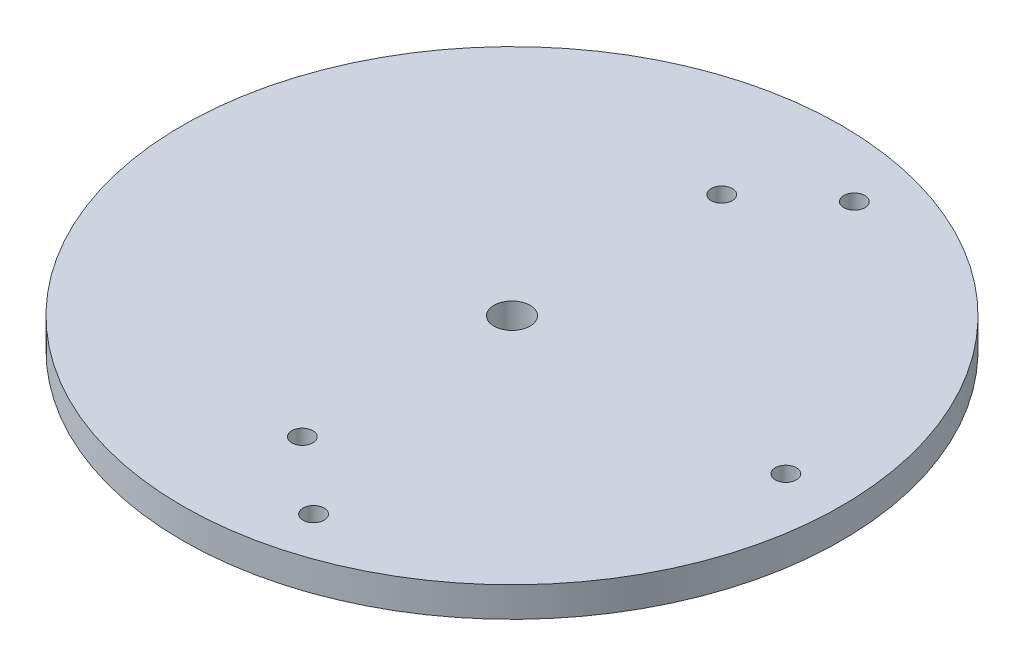
ISO-10303-21;
HEADER;
FILE_DESCRIPTION(('STEP AP214'),'2;1');
FILE_NAME('part.step','',(''),(''),'','','');
FILE_SCHEMA(('AUTOMOTIVE_DESIGN { 1 0 10303 214 1 1 1 1 }'));
ENDSEC;
DATA;
#1=APPLICATION_CONTEXT('core data for automotive mechanical design processes');
#2=APPLICATION_PROTOCOL_DEFINITION('international standard','automotive_design',2000,#1);
#3=PRODUCT_CONTEXT('',#1,'mechanical');
#4=PRODUCT('Part','Part','',(#3));
#5=PRODUCT_RELATED_PRODUCT_CATEGORY('part','',(#4));
#6=PRODUCT_DEFINITION_FORMATION('','',#4);
#7=PRODUCT_DEFINITION_CONTEXT('part definition',#1,'design');
#8=PRODUCT_DEFINITION('design','',#6,#7);
#9=PRODUCT_DEFINITION_SHAPE('','',#8);
#10=(LENGTH_UNIT() NAMED_UNIT(*) SI_UNIT(.MILLI.,.METRE.));
#11=(NAMED_UNIT(*) PLANE_ANGLE_UNIT() SI_UNIT($,.RADIAN.));
#12=(NAMED_UNIT(*) SI_UNIT($,.STERADIAN.) SOLID_ANGLE_UNIT());
#13=UNCERTAINTY_MEASURE_WITH_UNIT(LENGTH_MEASURE(1.E-05),#10,'distance_accuracy_value','');
#14=(GEOMETRIC_REPRESENTATION_CONTEXT(3) GLOBAL_UNCERTAINTY_ASSIGNED_CONTEXT((#13)) GLOBAL_UNIT_ASSIGNED_CONTEXT((#10,
#11,#12)) REPRESENTATION_CONTEXT('',''));
#15=CARTESIAN_POINT('',(0.,0.,0.));
#16=DIRECTION('',(0.,0.,1.));
#17=DIRECTION('',(1.,0.,0.));
#18=AXIS2_PLACEMENT_3D('',#15,#16,#17);
#19=CARTESIAN_POINT('',(-16.0725151747669,6.35,-12.0543863810752));
#20=DIRECTION('',(0.,-1.,0.));
#21=DIRECTION('',(0.,0.,-1.));
#22=AXIS2_PLACEMENT_3D('',#19,#20,#21);
#23=CYLINDRICAL_SURFACE('',#22,69.85);
#24=CARTESIAN_POINT('',(-16.0725151747669,6.35,-12.0543863810752));
#25=DIRECTION('',(0.,1.,0.));
#26=DIRECTION('',(0.,0.,1.));
#27=AXIS2_PLACEMENT_3D('',#24,#25,#26);
#28=CIRCLE('',#27,69.85);
#29=CARTESIAN_POINT('',(-16.0725151747669,6.35,57.7956136189248));
#30=VERTEX_POINT('',#29);
#31=EDGE_CURVE('E10',#30,#30,#28,.T.);
#32=ORIENTED_EDGE('',*,*,#31,.F.);
#33=EDGE_LOOP('',(#32));
#34=FACE_BOUND('',#33,.T.);
#35=CARTESIAN_POINT('',(-16.0725151747669,0.,-12.0543863810752));
#36=DIRECTION('',(0.,1.,0.));
#37=DIRECTION('',(0.,0.,1.));
#38=AXIS2_PLACEMENT_3D('',#35,#36,#37);
#39=CIRCLE('',#38,69.85);
#40=CARTESIAN_POINT('',(-16.0725151747669,0.,57.7956136189248));
#41=VERTEX_POINT('',#40);
#42=EDGE_CURVE('E44',#41,#41,#39,.T.);
#43=ORIENTED_EDGE('',*,*,#42,.T.);
#44=EDGE_LOOP('',(#43));
#45=FACE_BOUND('',#44,.T.);
#46=ADVANCED_FACE('F37',(#34,#45),#23,.T.);
#47=CARTESIAN_POINT('',(-16.0725151747669,6.35,-12.0543863810752));
#48=DIRECTION('',(0.,1.,0.));
#49=DIRECTION('',(0.,0.,1.));
#50=AXIS2_PLACEMENT_3D('',#47,#48,#49);
#51=PLANE('',#50);
#52=CARTESIAN_POINT('',(-0.738778165919699,6.35,-69.280671967993));
#53=DIRECTION('',(0.,1.,0.));
#54=DIRECTION('',(0.,0.,1.));
#55=AXIS2_PLACEMENT_3D('',#52,#53,#54);
#56=CIRCLE('',#55,2.238375);
#57=CARTESIAN_POINT('',(-0.738778165919699,6.35,-67.042296967993));
#58=VERTEX_POINT('',#57);
#59=EDGE_CURVE('E58',#58,#58,#56,.T.);
#60=ORIENTED_EDGE('',*,*,#59,.F.);
#61=EDGE_LOOP('',(#60));
#62=FACE_BOUND('',#61,.T.);
#63=CARTESIAN_POINT('',(-16.0725151747669,6.35,-56.5043863810752));
#64=DIRECTION('',(0.,1.,0.));
#65=DIRECTION('',(0.,0.,1.));
#66=AXIS2_PLACEMENT_3D('',#63,#64,#65);
#67=CIRCLE('',#66,2.238375);
#68=CARTESIAN_POINT('',(-16.0725151747669,6.35,-54.2660113810752));
#69=VERTEX_POINT('',#68);
#70=EDGE_CURVE('E134',#69,#69,#67,.T.);
#71=ORIENTED_EDGE('',*,*,#70,.F.);
#72=EDGE_LOOP('',(#71));
#73=FACE_BOUND('',#72,.T.);
#74=CARTESIAN_POINT('',(-16.0725151747669,6.35,-12.0543863810752));
#75=DIRECTION('',(0.,1.,0.));
#76=DIRECTION('',(0.,0.,1.));
#77=AXIS2_PLACEMENT_3D('',#74,#75,#76);
#78=CIRCLE('',#77,3.825875);
#79=CARTESIAN_POINT('',(-16.0725151747669,6.35,-8.2285113810752));
#80=VERTEX_POINT('',#79);
#81=EDGE_CURVE('E121',#80,#80,#78,.T.);
#82=ORIENTED_EDGE('',*,*,#81,.F.);
#83=EDGE_LOOP('',(#82));
#84=FACE_BOUND('',#83,.T.);
#85=CARTESIAN_POINT('',(-16.0725151747669,6.35,32.3956136189248));
#86=DIRECTION('',(0.,1.,0.));
#87=DIRECTION('',(0.,0.,1.));
#88=AXIS2_PLACEMENT_3D('',#85,#86,#87);
#89=CIRCLE('',#88,2.238375);
#90=CARTESIAN_POINT('',(-16.0725151747669,6.35,34.6339886189248));
#91=VERTEX_POINT('',#90);
#92=EDGE_CURVE('E135',#91,#91,#89,.T.);
#93=ORIENTED_EDGE('',*,*,#92,.F.);
#94=EDGE_LOOP('',(#93));
#95=FACE_BOUND('',#94,.T.);
#96=CARTESIAN_POINT('',(-0.679642183056859,6.35,45.3925976984422));
#97=DIRECTION('',(0.,1.,0.));
#98=DIRECTION('',(0.,0.,1.));
#99=AXIS2_PLACEMENT_3D('',#96,#97,#98);
#100=CIRCLE('',#99,2.238375);
#101=CARTESIAN_POINT('',(-0.679642183056859,6.35,47.6309726984422));
#102=VERTEX_POINT('',#101);
#103=EDGE_CURVE('E140',#102,#102,#100,.T.);
#104=ORIENTED_EDGE('',*,*,#103,.F.);
#105=EDGE_LOOP('',(#104));
#106=FACE_BOUND('',#105,.T.);
#107=CARTESIAN_POINT('',(41.9664848252331,6.35,-12.0543863810752));
#108=DIRECTION('',(0.,1.,0.));
#109=DIRECTION('',(0.,0.,1.));
#110=AXIS2_PLACEMENT_3D('',#107,#108,#109);
#111=CIRCLE('',#110,2.238375);
#112=CARTESIAN_POINT('',(41.9664848252331,6.35,-9.8160113810752));
#113=VERTEX_POINT('',#112);
#114=EDGE_CURVE('E51',#113,#113,#111,.T.);
#115=ORIENTED_EDGE('',*,*,#114,.F.);
#116=EDGE_LOOP('',(#115));
#117=FACE_BOUND('',#116,.T.);
#118=ORIENTED_EDGE('',*,*,#31,.T.);
#119=EDGE_LOOP('',(#118));
#120=FACE_BOUND('',#119,.T.);
#121=ADVANCED_FACE('F88',(#62,#73,#84,#95,#106,#117,#120),#51,.T.);
#122=CARTESIAN_POINT('',(-16.0725151747669,0.,-12.0543863810752));
#123=DIRECTION('',(0.,1.,0.));
#124=DIRECTION('',(0.,0.,1.));
#125=AXIS2_PLACEMENT_3D('',#122,#123,#124);
#126=PLANE('',#125);
#127=CARTESIAN_POINT('',(-0.738778165919699,0.,-69.280671967993));
#128=DIRECTION('',(0.,1.,0.));
#129=DIRECTION('',(0.,0.,1.));
#130=AXIS2_PLACEMENT_3D('',#127,#128,#129);
#131=CIRCLE('',#130,2.238375);
#132=CARTESIAN_POINT('',(-0.738778165919699,0.,-67.042296967993));
#133=VERTEX_POINT('',#132);
#134=EDGE_CURVE('E40',#133,#133,#131,.T.);
#135=ORIENTED_EDGE('',*,*,#134,.T.);
#136=EDGE_LOOP('',(#135));
#137=FACE_BOUND('',#136,.T.);
#138=CARTESIAN_POINT('',(-16.0725151747669,0.,-56.5043863810752));
#139=DIRECTION('',(0.,1.,0.));
#140=DIRECTION('',(0.,0.,1.));
#141=AXIS2_PLACEMENT_3D('',#138,#139,#140);
#142=CIRCLE('',#141,2.238375);
#143=CARTESIAN_POINT('',(-16.0725151747669,0.,-54.2660113810752));
#144=VERTEX_POINT('',#143);
#145=EDGE_CURVE('E66',#144,#144,#142,.T.);
#146=ORIENTED_EDGE('',*,*,#145,.T.);
#147=EDGE_LOOP('',(#146));
#148=FACE_BOUND('',#147,.T.);
#149=CARTESIAN_POINT('',(-16.0725151747669,0.,-12.0543863810752));
#150=DIRECTION('',(0.,1.,0.));
#151=DIRECTION('',(0.,0.,1.));
#152=AXIS2_PLACEMENT_3D('',#149,#150,#151);
#153=CIRCLE('',#152,3.825875);
#154=CARTESIAN_POINT('',(-16.0725151747669,0.,-8.2285113810752));
#155=VERTEX_POINT('',#154);
#156=EDGE_CURVE('E64',#155,#155,#153,.T.);
#157=ORIENTED_EDGE('',*,*,#156,.T.);
#158=EDGE_LOOP('',(#157));
#159=FACE_BOUND('',#158,.T.);
#160=CARTESIAN_POINT('',(-16.0725151747669,0.,32.3956136189248));
#161=DIRECTION('',(0.,1.,0.));
#162=DIRECTION('',(0.,0.,1.));
#163=AXIS2_PLACEMENT_3D('',#160,#161,#162);
#164=CIRCLE('',#163,2.238375);
#165=CARTESIAN_POINT('',(-16.0725151747669,0.,34.6339886189248));
#166=VERTEX_POINT('',#165);
#167=EDGE_CURVE('E61',#166,#166,#164,.T.);
#168=ORIENTED_EDGE('',*,*,#167,.T.);
#169=EDGE_LOOP('',(#168));
#170=FACE_BOUND('',#169,.T.);
#171=CARTESIAN_POINT('',(-0.679642183056859,0.,45.3925976984422));
#172=DIRECTION('',(0.,1.,0.));
#173=DIRECTION('',(0.,0.,1.));
#174=AXIS2_PLACEMENT_3D('',#171,#172,#173);
#175=CIRCLE('',#174,2.238375);
#176=CARTESIAN_POINT('',(-0.679642183056859,0.,47.6309726984422));
#177=VERTEX_POINT('',#176);
#178=EDGE_CURVE('E57',#177,#177,#175,.T.);
#179=ORIENTED_EDGE('',*,*,#178,.T.);
#180=EDGE_LOOP('',(#179));
#181=FACE_BOUND('',#180,.T.);
#182=CARTESIAN_POINT('',(41.9664848252331,0.,-12.0543863810752));
#183=DIRECTION('',(0.,1.,0.));
#184=DIRECTION('',(0.,0.,1.));
#185=AXIS2_PLACEMENT_3D('',#182,#183,#184);
#186=CIRCLE('',#185,2.238375);
#187=CARTESIAN_POINT('',(41.9664848252331,0.,-9.8160113810752));
#188=VERTEX_POINT('',#187);
#189=EDGE_CURVE('E54',#188,#188,#186,.T.);
#190=ORIENTED_EDGE('',*,*,#189,.T.);
#191=EDGE_LOOP('',(#190));
#192=FACE_BOUND('',#191,.T.);
#193=ORIENTED_EDGE('',*,*,#42,.F.);
#194=EDGE_LOOP('',(#193));
#195=FACE_BOUND('',#194,.T.);
#196=ADVANCED_FACE('F73',(#137,#148,#159,#170,#181,#192,#195),#126,.F.);
#197=CARTESIAN_POINT('',(41.9664848252331,-6.35,-12.0543863810752));
#198=DIRECTION('',(0.,1.,0.));
#199=DIRECTION('',(0.,0.,1.));
#200=AXIS2_PLACEMENT_3D('',#197,#198,#199);
#201=CYLINDRICAL_SURFACE('',#200,2.238375);
#202=ORIENTED_EDGE('',*,*,#114,.T.);
#203=EDGE_LOOP('',(#202));
#204=FACE_BOUND('',#203,.T.);
#205=ORIENTED_EDGE('',*,*,#189,.F.);
#206=EDGE_LOOP('',(#205));
#207=FACE_BOUND('',#206,.T.);
#208=ADVANCED_FACE('F99',(#204,#207),#201,.F.);
#209=CARTESIAN_POINT('',(-0.679642183056859,-6.35,45.3925976984422));
#210=DIRECTION('',(0.,1.,0.));
#211=DIRECTION('',(0.,0.,1.));
#212=AXIS2_PLACEMENT_3D('',#209,#210,#211);
#213=CYLINDRICAL_SURFACE('',#212,2.238375);
#214=ORIENTED_EDGE('',*,*,#103,.T.);
#215=EDGE_LOOP('',(#214));
#216=FACE_BOUND('',#215,.T.);
#217=ORIENTED_EDGE('',*,*,#178,.F.);
#218=EDGE_LOOP('',(#217));
#219=FACE_BOUND('',#218,.T.);
#220=ADVANCED_FACE('F103',(#216,#219),#213,.F.);
#221=CARTESIAN_POINT('',(-16.0725151747669,-6.35,32.3956136189248));
#222=DIRECTION('',(0.,1.,0.));
#223=DIRECTION('',(0.,0.,1.));
#224=AXIS2_PLACEMENT_3D('',#221,#222,#223);
#225=CYLINDRICAL_SURFACE('',#224,2.238375);
#226=ORIENTED_EDGE('',*,*,#92,.T.);
#227=EDGE_LOOP('',(#226));
#228=FACE_BOUND('',#227,.T.);
#229=ORIENTED_EDGE('',*,*,#167,.F.);
#230=EDGE_LOOP('',(#229));
#231=FACE_BOUND('',#230,.T.);
#232=ADVANCED_FACE('F109',(#228,#231),#225,.F.);
#233=CARTESIAN_POINT('',(-16.0725151747669,-6.35,-12.0543863810752));
#234=DIRECTION('',(0.,1.,0.));
#235=DIRECTION('',(0.,0.,1.));
#236=AXIS2_PLACEMENT_3D('',#233,#234,#235);
#237=CYLINDRICAL_SURFACE('',#236,3.825875);
#238=ORIENTED_EDGE('',*,*,#81,.T.);
#239=EDGE_LOOP('',(#238));
#240=FACE_BOUND('',#239,.T.);
#241=ORIENTED_EDGE('',*,*,#156,.F.);
#242=EDGE_LOOP('',(#241));
#243=FACE_BOUND('',#242,.T.);
#244=ADVANCED_FACE('F83',(#240,#243),#237,.F.);
#245=CARTESIAN_POINT('',(-16.0725151747669,-6.35,-56.5043863810752));
#246=DIRECTION('',(0.,1.,0.));
#247=DIRECTION('',(0.,0.,1.));
#248=AXIS2_PLACEMENT_3D('',#245,#246,#247);
#249=CYLINDRICAL_SURFACE('',#248,2.238375);
#250=ORIENTED_EDGE('',*,*,#70,.T.);
#251=EDGE_LOOP('',(#250));
#252=FACE_BOUND('',#251,.T.);
#253=ORIENTED_EDGE('',*,*,#145,.F.);
#254=EDGE_LOOP('',(#253));
#255=FACE_BOUND('',#254,.T.);
#256=ADVANCED_FACE('F77',(#252,#255),#249,.F.);
#257=CARTESIAN_POINT('',(-0.738778165919699,-6.35,-69.280671967993));
#258=DIRECTION('',(0.,1.,0.));
#259=DIRECTION('',(0.,0.,1.));
#260=AXIS2_PLACEMENT_3D('',#257,#258,#259);
#261=CYLINDRICAL_SURFACE('',#260,2.238375);
#262=ORIENTED_EDGE('',*,*,#59,.T.);
#263=EDGE_LOOP('',(#262));
#264=FACE_BOUND('',#263,.T.);
#265=ORIENTED_EDGE('',*,*,#134,.F.);
#266=EDGE_LOOP('',(#265));
#267=FACE_BOUND('',#266,.T.);
#268=ADVANCED_FACE('F75',(#264,#267),#261,.F.);
#269=CLOSED_SHELL('',(#46,#121,#196,#208,#220,#232,#244,#256,#268));
#270=MANIFOLD_SOLID_BREP('B2',#269);
#271=ADVANCED_BREP_SHAPE_REPRESENTATION('',(#18,#270),#14);
#272=SHAPE_DEFINITION_REPRESENTATION(#9,#271);
ENDSEC;
END-ISO-10303-21;
